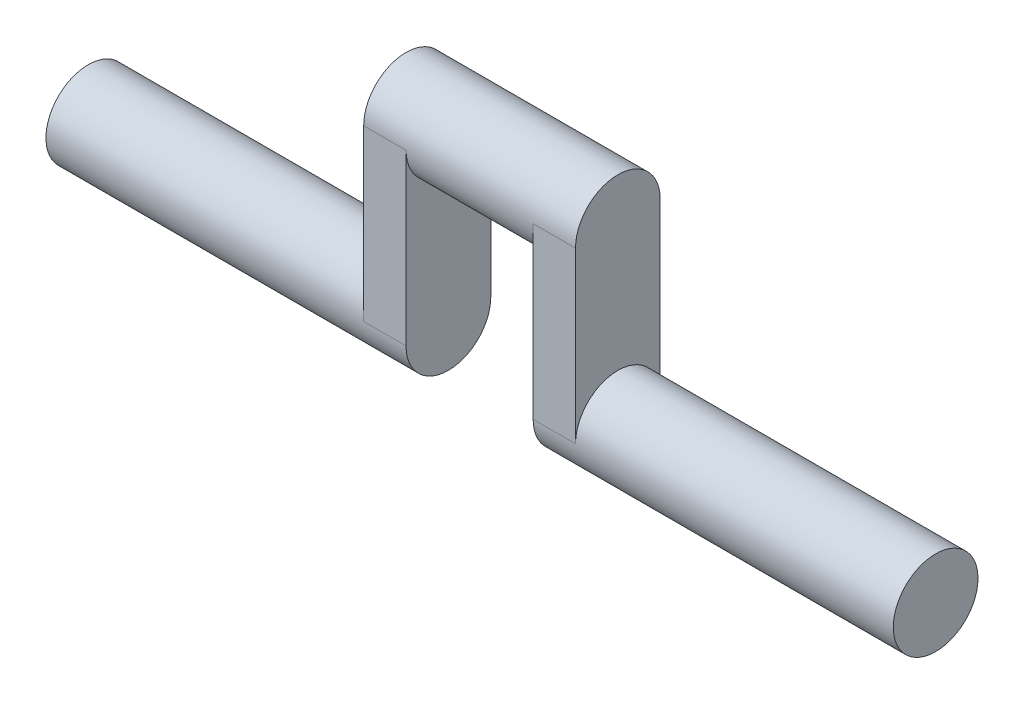
ISO-10303-21;
HEADER;
FILE_DESCRIPTION(('STEP AP214'),'2;1');
FILE_NAME('part.step','',(''),(''),'','','');
FILE_SCHEMA(('AUTOMOTIVE_DESIGN { 1 0 10303 214 1 1 1 1 }'));
ENDSEC;
DATA;
#1=APPLICATION_CONTEXT('core data for automotive mechanical design processes');
#2=APPLICATION_PROTOCOL_DEFINITION('international standard','automotive_design',2000,#1);
#3=PRODUCT_CONTEXT('',#1,'mechanical');
#4=PRODUCT('Part','Part','',(#3));
#5=PRODUCT_RELATED_PRODUCT_CATEGORY('part','',(#4));
#6=PRODUCT_DEFINITION_FORMATION('','',#4);
#7=PRODUCT_DEFINITION_CONTEXT('part definition',#1,'design');
#8=PRODUCT_DEFINITION('design','',#6,#7);
#9=PRODUCT_DEFINITION_SHAPE('','',#8);
#10=(LENGTH_UNIT() NAMED_UNIT(*) SI_UNIT(.MILLI.,.METRE.));
#11=(NAMED_UNIT(*) PLANE_ANGLE_UNIT() SI_UNIT($,.RADIAN.));
#12=(NAMED_UNIT(*) SI_UNIT($,.STERADIAN.) SOLID_ANGLE_UNIT());
#13=UNCERTAINTY_MEASURE_WITH_UNIT(LENGTH_MEASURE(1.E-05),#10,'distance_accuracy_value','');
#14=(GEOMETRIC_REPRESENTATION_CONTEXT(3) GLOBAL_UNCERTAINTY_ASSIGNED_CONTEXT((#13)) GLOBAL_UNIT_ASSIGNED_CONTEXT((#10,
#11,#12)) REPRESENTATION_CONTEXT('',''));
#15=CARTESIAN_POINT('',(0.,0.,0.));
#16=DIRECTION('',(0.,0.,1.));
#17=DIRECTION('',(1.,0.,0.));
#18=AXIS2_PLACEMENT_3D('',#15,#16,#17);
#19=CARTESIAN_POINT('',(-42.5,20.,0.));
#20=DIRECTION('',(1.,0.,0.));
#21=DIRECTION('',(0.,0.,-1.));
#22=AXIS2_PLACEMENT_3D('',#19,#20,#21);
#23=CYLINDRICAL_SURFACE('',#22,5.);
#24=CARTESIAN_POINT('',(-37.5,20.,0.));
#25=DIRECTION('',(1.,0.,0.));
#26=DIRECTION('',(0.,0.,-1.));
#27=AXIS2_PLACEMENT_3D('',#24,#25,#26);
#28=CIRCLE('',#27,5.);
#29=CARTESIAN_POINT('',(-37.5,20.,-5.));
#30=VERTEX_POINT('',#29);
#31=CARTESIAN_POINT('',(-37.5,20.,5.));
#32=VERTEX_POINT('',#31);
#33=EDGE_CURVE('E173',#30,#32,#28,.T.);
#34=ORIENTED_EDGE('',*,*,#33,.F.);
#35=DIRECTION('',(1.,0.,0.));
#36=VECTOR('',#35,1.);
#37=CARTESIAN_POINT('',(-42.5,20.,-5.));
#38=LINE('',#37,#36);
#39=CARTESIAN_POINT('',(-42.5,20.,-5.));
#40=VERTEX_POINT('',#39);
#41=EDGE_CURVE('E169',#40,#30,#38,.T.);
#42=ORIENTED_EDGE('',*,*,#41,.F.);
#43=CARTESIAN_POINT('',(-42.5,20.,0.));
#44=DIRECTION('',(1.,0.,0.));
#45=DIRECTION('',(0.,0.,-1.));
#46=AXIS2_PLACEMENT_3D('',#43,#44,#45);
#47=CIRCLE('',#46,5.);
#48=CARTESIAN_POINT('',(-42.5,20.,5.));
#49=VERTEX_POINT('',#48);
#50=EDGE_CURVE('E156',#49,#40,#47,.T.);
#51=ORIENTED_EDGE('',*,*,#50,.F.);
#52=DIRECTION('',(1.,0.,0.));
#53=VECTOR('',#52,1.);
#54=CARTESIAN_POINT('',(-42.5,20.,5.));
#55=LINE('',#54,#53);
#56=EDGE_CURVE('E190',#49,#32,#55,.T.);
#57=ORIENTED_EDGE('',*,*,#56,.T.);
#58=EDGE_LOOP('',(#34,#42,#51,#57));
#59=FACE_BOUND('',#58,.T.);
#60=CARTESIAN_POINT('',(-57.5,20.,0.));
#61=DIRECTION('',(1.,0.,0.));
#62=DIRECTION('',(0.,0.,-1.));
#63=AXIS2_PLACEMENT_3D('',#60,#61,#62);
#64=CIRCLE('',#63,5.);
#65=CARTESIAN_POINT('',(-57.5,20.,5.00000000000001));
#66=VERTEX_POINT('',#65);
#67=CARTESIAN_POINT('',(-57.5,20.,-5.));
#68=VERTEX_POINT('',#67);
#69=EDGE_CURVE('E60',#66,#68,#64,.T.);
#70=ORIENTED_EDGE('',*,*,#69,.T.);
#71=DIRECTION('',(-1.,0.,0.));
#72=VECTOR('',#71,1.);
#73=CARTESIAN_POINT('',(-57.5,20.,-5.));
#74=LINE('',#73,#72);
#75=CARTESIAN_POINT('',(-62.5,20.,-5.));
#76=VERTEX_POINT('',#75);
#77=EDGE_CURVE('E149',#68,#76,#74,.T.);
#78=ORIENTED_EDGE('',*,*,#77,.T.);
#79=CARTESIAN_POINT('',(-62.5,20.,0.));
#80=DIRECTION('',(1.,0.,0.));
#81=DIRECTION('',(0.,0.,-1.));
#82=AXIS2_PLACEMENT_3D('',#79,#80,#81);
#83=CIRCLE('',#82,5.);
#84=CARTESIAN_POINT('',(-62.5,20.,5.));
#85=VERTEX_POINT('',#84);
#86=EDGE_CURVE('E148',#76,#85,#83,.T.);
#87=ORIENTED_EDGE('',*,*,#86,.T.);
#88=DIRECTION('',(-1.,0.,0.));
#89=VECTOR('',#88,1.);
#90=CARTESIAN_POINT('',(-57.5,20.,5.00000000000001));
#91=LINE('',#90,#89);
#92=EDGE_CURVE('E55',#66,#85,#91,.T.);
#93=ORIENTED_EDGE('',*,*,#92,.F.);
#94=EDGE_LOOP('',(#70,#78,#87,#93));
#95=FACE_BOUND('',#94,.T.);
#96=ADVANCED_FACE('F39',(#59,#95),#23,.T.);
#97=CARTESIAN_POINT('',(-42.5,0.,0.));
#98=DIRECTION('',(1.,0.,0.));
#99=DIRECTION('',(0.,0.,-1.));
#100=AXIS2_PLACEMENT_3D('',#97,#98,#99);
#101=CYLINDRICAL_SURFACE('',#100,5.);
#102=DIRECTION('',(1.,0.,0.));
#103=VECTOR('',#102,1.);
#104=CARTESIAN_POINT('',(-42.5,0.,-5.));
#105=LINE('',#104,#103);
#106=CARTESIAN_POINT('',(-42.5,0.,-5.));
#107=VERTEX_POINT('',#106);
#108=CARTESIAN_POINT('',(-37.5,0.,-5.));
#109=VERTEX_POINT('',#108);
#110=EDGE_CURVE('E183',#107,#109,#105,.T.);
#111=ORIENTED_EDGE('',*,*,#110,.T.);
#112=CARTESIAN_POINT('',(-37.5,0.,0.));
#113=DIRECTION('',(1.,0.,0.));
#114=DIRECTION('',(0.,0.,-1.));
#115=AXIS2_PLACEMENT_3D('',#112,#113,#114);
#116=CIRCLE('',#115,5.);
#117=CARTESIAN_POINT('',(-37.5,0.,5.));
#118=VERTEX_POINT('',#117);
#119=EDGE_CURVE('E165',#109,#118,#116,.T.);
#120=ORIENTED_EDGE('',*,*,#119,.T.);
#121=DIRECTION('',(1.,0.,0.));
#122=VECTOR('',#121,1.);
#123=CARTESIAN_POINT('',(-42.5,0.,5.));
#124=LINE('',#123,#122);
#125=CARTESIAN_POINT('',(-42.5,0.,5.));
#126=VERTEX_POINT('',#125);
#127=EDGE_CURVE('E186',#126,#118,#124,.T.);
#128=ORIENTED_EDGE('',*,*,#127,.F.);
#129=CARTESIAN_POINT('',(-42.5,0.,0.));
#130=DIRECTION('',(1.,0.,0.));
#131=DIRECTION('',(0.,0.,-1.));
#132=AXIS2_PLACEMENT_3D('',#129,#130,#131);
#133=CIRCLE('',#132,5.);
#134=EDGE_CURVE('E11',#126,#107,#133,.T.);
#135=ORIENTED_EDGE('',*,*,#134,.T.);
#136=EDGE_LOOP('',(#111,#120,#128,#135));
#137=FACE_BOUND('',#136,.T.);
#138=CARTESIAN_POINT('',(0.,0.,0.));
#139=DIRECTION('',(1.,0.,0.));
#140=DIRECTION('',(0.,0.,-1.));
#141=AXIS2_PLACEMENT_3D('',#138,#139,#140);
#142=CIRCLE('',#141,5.);
#143=CARTESIAN_POINT('',(0.,0.,-5.));
#144=VERTEX_POINT('',#143);
#145=EDGE_CURVE('E43',#144,#144,#142,.T.);
#146=ORIENTED_EDGE('',*,*,#145,.F.);
#147=EDGE_LOOP('',(#146));
#148=FACE_BOUND('',#147,.T.);
#149=ADVANCED_FACE('F41',(#137,#148),#101,.T.);
#150=CARTESIAN_POINT('',(-42.5,0.,0.));
#151=DIRECTION('',(1.,0.,0.));
#152=DIRECTION('',(0.,0.,-1.));
#153=AXIS2_PLACEMENT_3D('',#150,#151,#152);
#154=PLANE('',#153);
#155=DIRECTION('',(0.,-1.,0.));
#156=VECTOR('',#155,1.);
#157=CARTESIAN_POINT('',(-42.5,0.,5.));
#158=LINE('',#157,#156);
#159=EDGE_CURVE('E164',#49,#126,#158,.T.);
#160=ORIENTED_EDGE('',*,*,#159,.F.);
#161=ORIENTED_EDGE('',*,*,#50,.T.);
#162=DIRECTION('',(0.,-1.,0.));
#163=VECTOR('',#162,1.);
#164=CARTESIAN_POINT('',(-42.5,0.,-5.));
#165=LINE('',#164,#163);
#166=EDGE_CURVE('E160',#40,#107,#165,.T.);
#167=ORIENTED_EDGE('',*,*,#166,.T.);
#168=ORIENTED_EDGE('',*,*,#134,.F.);
#169=EDGE_LOOP('',(#160,#161,#167,#168));
#170=FACE_BOUND('',#169,.T.);
#171=ADVANCED_FACE('F214',(#170),#154,.F.);
#172=CARTESIAN_POINT('',(0.,0.,0.));
#173=DIRECTION('',(1.,0.,0.));
#174=DIRECTION('',(0.,0.,-1.));
#175=AXIS2_PLACEMENT_3D('',#172,#173,#174);
#176=PLANE('',#175);
#177=ORIENTED_EDGE('',*,*,#145,.T.);
#178=EDGE_LOOP('',(#177));
#179=FACE_BOUND('',#178,.T.);
#180=ADVANCED_FACE('F216',(#179),#176,.T.);
#181=CARTESIAN_POINT('',(-42.5,0.,-5.));
#182=DIRECTION('',(0.,0.,1.));
#183=DIRECTION('',(0.,-1.,0.));
#184=AXIS2_PLACEMENT_3D('',#181,#182,#183);
#185=PLANE('',#184);
#186=DIRECTION('',(0.,-1.,0.));
#187=VECTOR('',#186,1.);
#188=CARTESIAN_POINT('',(-37.5,0.,-5.));
#189=LINE('',#188,#187);
#190=EDGE_CURVE('E159',#30,#109,#189,.T.);
#191=ORIENTED_EDGE('',*,*,#190,.T.);
#192=ORIENTED_EDGE('',*,*,#110,.F.);
#193=ORIENTED_EDGE('',*,*,#166,.F.);
#194=ORIENTED_EDGE('',*,*,#41,.T.);
#195=EDGE_LOOP('',(#191,#192,#193,#194));
#196=FACE_BOUND('',#195,.T.);
#197=ADVANCED_FACE('F198',(#196),#185,.F.);
#198=CARTESIAN_POINT('',(-42.5,0.,5.));
#199=DIRECTION('',(0.,0.,1.));
#200=DIRECTION('',(0.,-1.,0.));
#201=AXIS2_PLACEMENT_3D('',#198,#199,#200);
#202=PLANE('',#201);
#203=DIRECTION('',(0.,-1.,0.));
#204=VECTOR('',#203,1.);
#205=CARTESIAN_POINT('',(-37.5,0.,5.));
#206=LINE('',#205,#204);
#207=EDGE_CURVE('E177',#32,#118,#206,.T.);
#208=ORIENTED_EDGE('',*,*,#207,.F.);
#209=ORIENTED_EDGE('',*,*,#56,.F.);
#210=ORIENTED_EDGE('',*,*,#159,.T.);
#211=ORIENTED_EDGE('',*,*,#127,.T.);
#212=EDGE_LOOP('',(#208,#209,#210,#211));
#213=FACE_BOUND('',#212,.T.);
#214=ADVANCED_FACE('F209',(#213),#202,.T.);
#215=CARTESIAN_POINT('',(-37.5,0.,0.));
#216=DIRECTION('',(1.,0.,0.));
#217=DIRECTION('',(0.,0.,-1.));
#218=AXIS2_PLACEMENT_3D('',#215,#216,#217);
#219=PLANE('',#218);
#220=ORIENTED_EDGE('',*,*,#190,.F.);
#221=ORIENTED_EDGE('',*,*,#33,.T.);
#222=ORIENTED_EDGE('',*,*,#207,.T.);
#223=ORIENTED_EDGE('',*,*,#119,.F.);
#224=EDGE_LOOP('',(#220,#221,#222,#223));
#225=FACE_BOUND('',#224,.T.);
#226=ADVANCED_FACE('F204',(#225),#219,.T.);
#227=CARTESIAN_POINT('',(-62.5,0.,0.));
#228=DIRECTION('',(1.,0.,0.));
#229=DIRECTION('',(0.,0.,-1.));
#230=AXIS2_PLACEMENT_3D('',#227,#228,#229);
#231=PLANE('',#230);
#232=ORIENTED_EDGE('',*,*,#86,.F.);
#233=DIRECTION('',(0.,-1.,0.));
#234=VECTOR('',#233,1.);
#235=CARTESIAN_POINT('',(-62.5,0.,-5.));
#236=LINE('',#235,#234);
#237=CARTESIAN_POINT('',(-62.5,0.,-5.));
#238=VERTEX_POINT('',#237);
#239=EDGE_CURVE('E122',#76,#238,#236,.T.);
#240=ORIENTED_EDGE('',*,*,#239,.T.);
#241=CARTESIAN_POINT('',(-62.5,0.,0.));
#242=DIRECTION('',(1.,0.,0.));
#243=DIRECTION('',(0.,0.,-1.));
#244=AXIS2_PLACEMENT_3D('',#241,#242,#243);
#245=CIRCLE('',#244,5.);
#246=CARTESIAN_POINT('',(-62.5,0.,5.));
#247=VERTEX_POINT('',#246);
#248=EDGE_CURVE('E132',#238,#247,#245,.T.);
#249=ORIENTED_EDGE('',*,*,#248,.T.);
#250=DIRECTION('',(0.,-1.,0.));
#251=VECTOR('',#250,1.);
#252=CARTESIAN_POINT('',(-62.5,0.,5.));
#253=LINE('',#252,#251);
#254=EDGE_CURVE('E108',#85,#247,#253,.T.);
#255=ORIENTED_EDGE('',*,*,#254,.F.);
#256=EDGE_LOOP('',(#232,#240,#249,#255));
#257=FACE_BOUND('',#256,.T.);
#258=ADVANCED_FACE('F237',(#257),#231,.F.);
#259=CARTESIAN_POINT('',(-57.5,0.,-5.));
#260=DIRECTION('',(0.,0.,-1.));
#261=DIRECTION('',(0.,1.,0.));
#262=AXIS2_PLACEMENT_3D('',#259,#260,#261);
#263=PLANE('',#262);
#264=ORIENTED_EDGE('',*,*,#239,.F.);
#265=ORIENTED_EDGE('',*,*,#77,.F.);
#266=DIRECTION('',(0.,-1.,0.));
#267=VECTOR('',#266,1.);
#268=CARTESIAN_POINT('',(-57.5,0.,-5.));
#269=LINE('',#268,#267);
#270=CARTESIAN_POINT('',(-57.5,0.,-5.));
#271=VERTEX_POINT('',#270);
#272=EDGE_CURVE('E114',#68,#271,#269,.T.);
#273=ORIENTED_EDGE('',*,*,#272,.T.);
#274=DIRECTION('',(-1.,0.,0.));
#275=VECTOR('',#274,1.);
#276=CARTESIAN_POINT('',(-57.5,0.,-5.));
#277=LINE('',#276,#275);
#278=EDGE_CURVE('E126',#271,#238,#277,.T.);
#279=ORIENTED_EDGE('',*,*,#278,.T.);
#280=EDGE_LOOP('',(#264,#265,#273,#279));
#281=FACE_BOUND('',#280,.T.);
#282=ADVANCED_FACE('F241',(#281),#263,.T.);
#283=CARTESIAN_POINT('',(-57.5,0.,5.));
#284=DIRECTION('',(0.,0.,-1.));
#285=DIRECTION('',(0.,1.,0.));
#286=AXIS2_PLACEMENT_3D('',#283,#284,#285);
#287=PLANE('',#286);
#288=ORIENTED_EDGE('',*,*,#254,.T.);
#289=DIRECTION('',(-1.,0.,0.));
#290=VECTOR('',#289,1.);
#291=CARTESIAN_POINT('',(-57.5,0.,5.));
#292=LINE('',#291,#290);
#293=CARTESIAN_POINT('',(-57.5,0.,5.));
#294=VERTEX_POINT('',#293);
#295=EDGE_CURVE('E103',#294,#247,#292,.T.);
#296=ORIENTED_EDGE('',*,*,#295,.F.);
#297=DIRECTION('',(0.,-1.,0.));
#298=VECTOR('',#297,1.);
#299=CARTESIAN_POINT('',(-57.5,0.,5.));
#300=LINE('',#299,#298);
#301=EDGE_CURVE('E106',#66,#294,#300,.T.);
#302=ORIENTED_EDGE('',*,*,#301,.F.);
#303=ORIENTED_EDGE('',*,*,#92,.T.);
#304=EDGE_LOOP('',(#288,#296,#302,#303));
#305=FACE_BOUND('',#304,.T.);
#306=ADVANCED_FACE('F105',(#305),#287,.F.);
#307=CARTESIAN_POINT('',(-57.5,0.,0.));
#308=DIRECTION('',(1.,0.,0.));
#309=DIRECTION('',(0.,0.,-1.));
#310=AXIS2_PLACEMENT_3D('',#307,#308,#309);
#311=PLANE('',#310);
#312=ORIENTED_EDGE('',*,*,#301,.T.);
#313=CARTESIAN_POINT('',(-57.5,0.,0.));
#314=DIRECTION('',(1.,0.,0.));
#315=DIRECTION('',(0.,0.,-1.));
#316=AXIS2_PLACEMENT_3D('',#313,#314,#315);
#317=CIRCLE('',#316,5.);
#318=EDGE_CURVE('E120',#294,#271,#317,.T.);
#319=ORIENTED_EDGE('',*,*,#318,.T.);
#320=ORIENTED_EDGE('',*,*,#272,.F.);
#321=ORIENTED_EDGE('',*,*,#69,.F.);
#322=EDGE_LOOP('',(#312,#319,#320,#321));
#323=FACE_BOUND('',#322,.T.);
#324=ADVANCED_FACE('F118',(#323),#311,.T.);
#325=CARTESIAN_POINT('',(-100.,0.,0.));
#326=DIRECTION('',(1.,0.,0.));
#327=DIRECTION('',(0.,0.,-1.));
#328=AXIS2_PLACEMENT_3D('',#325,#326,#327);
#329=CYLINDRICAL_SURFACE('',#328,5.);
#330=CARTESIAN_POINT('',(-100.,0.,0.));
#331=DIRECTION('',(1.,0.,0.));
#332=DIRECTION('',(0.,0.,-1.));
#333=AXIS2_PLACEMENT_3D('',#330,#331,#332);
#334=CIRCLE('',#333,5.);
#335=CARTESIAN_POINT('',(-100.,0.,-5.));
#336=VERTEX_POINT('',#335);
#337=EDGE_CURVE('E128',#336,#336,#334,.T.);
#338=ORIENTED_EDGE('',*,*,#337,.T.);
#339=EDGE_LOOP('',(#338));
#340=FACE_BOUND('',#339,.T.);
#341=ORIENTED_EDGE('',*,*,#248,.F.);
#342=ORIENTED_EDGE('',*,*,#278,.F.);
#343=ORIENTED_EDGE('',*,*,#318,.F.);
#344=ORIENTED_EDGE('',*,*,#295,.T.);
#345=EDGE_LOOP('',(#341,#342,#343,#344));
#346=FACE_BOUND('',#345,.T.);
#347=ADVANCED_FACE('F125',(#340,#346),#329,.T.);
#348=CARTESIAN_POINT('',(-100.,0.,0.));
#349=DIRECTION('',(1.,0.,0.));
#350=DIRECTION('',(0.,0.,-1.));
#351=AXIS2_PLACEMENT_3D('',#348,#349,#350);
#352=PLANE('',#351);
#353=ORIENTED_EDGE('',*,*,#337,.F.);
#354=EDGE_LOOP('',(#353));
#355=FACE_BOUND('',#354,.T.);
#356=ADVANCED_FACE('F254',(#355),#352,.F.);
#357=CLOSED_SHELL('',(#96,#149,#171,#180,#197,#214,#226,#258,#282,#306,#324,#347,#356));
#358=MANIFOLD_SOLID_BREP('B2',#357);
#359=ADVANCED_BREP_SHAPE_REPRESENTATION('',(#18,#358),#14);
#360=SHAPE_DEFINITION_REPRESENTATION(#9,#359);
ENDSEC;
END-ISO-10303-21;
